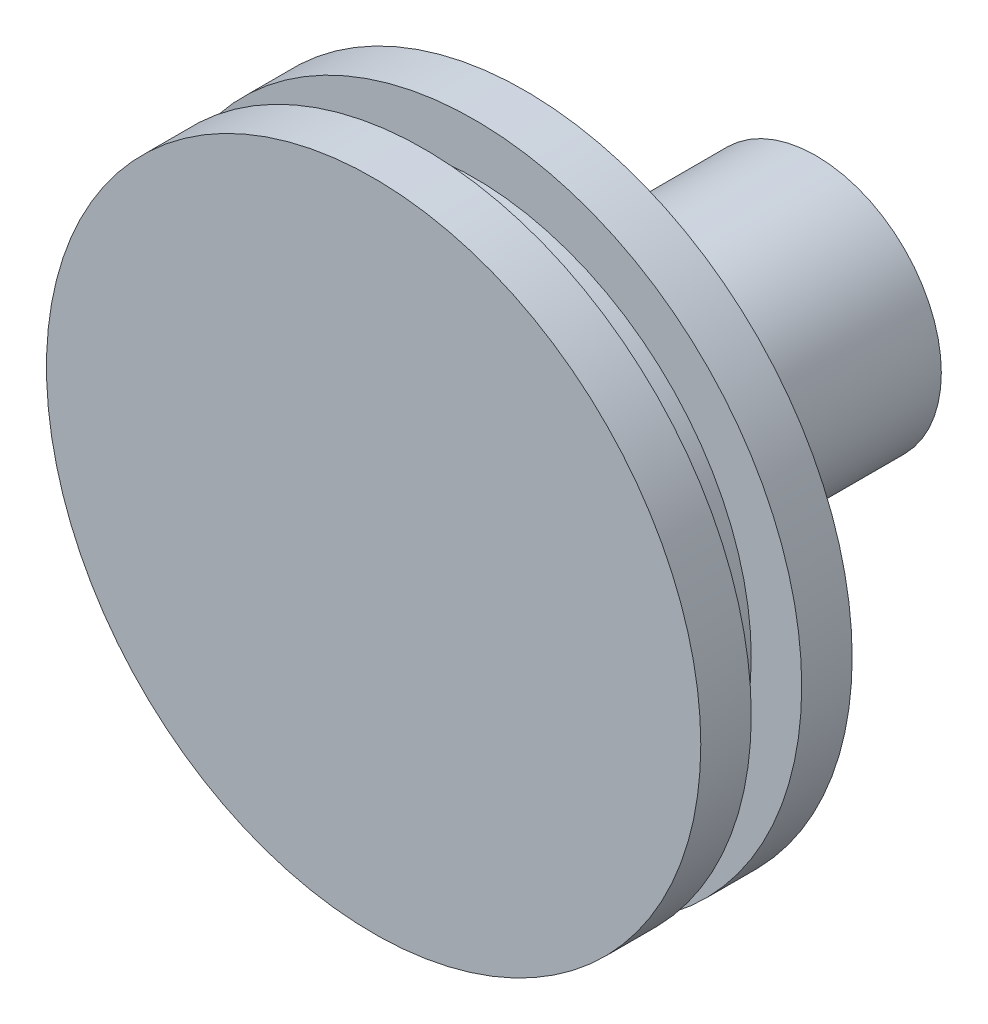
ISO-10303-21;
HEADER;
FILE_DESCRIPTION(('STEP AP214'),'2;1');
FILE_NAME('part.step','',(''),(''),'','','');
FILE_SCHEMA(('AUTOMOTIVE_DESIGN { 1 0 10303 214 1 1 1 1 }'));
ENDSEC;
DATA;
#1=APPLICATION_CONTEXT('core data for automotive mechanical design processes');
#2=APPLICATION_PROTOCOL_DEFINITION('international standard','automotive_design',2000,#1);
#3=PRODUCT_CONTEXT('',#1,'mechanical');
#4=PRODUCT('Part','Part','',(#3));
#5=PRODUCT_RELATED_PRODUCT_CATEGORY('part','',(#4));
#6=PRODUCT_DEFINITION_FORMATION('','',#4);
#7=PRODUCT_DEFINITION_CONTEXT('part definition',#1,'design');
#8=PRODUCT_DEFINITION('design','',#6,#7);
#9=PRODUCT_DEFINITION_SHAPE('','',#8);
#10=(LENGTH_UNIT() NAMED_UNIT(*) SI_UNIT(.MILLI.,.METRE.));
#11=(NAMED_UNIT(*) PLANE_ANGLE_UNIT() SI_UNIT($,.RADIAN.));
#12=(NAMED_UNIT(*) SI_UNIT($,.STERADIAN.) SOLID_ANGLE_UNIT());
#13=UNCERTAINTY_MEASURE_WITH_UNIT(LENGTH_MEASURE(1.E-05),#10,'distance_accuracy_value','');
#14=(GEOMETRIC_REPRESENTATION_CONTEXT(3) GLOBAL_UNCERTAINTY_ASSIGNED_CONTEXT((#13)) GLOBAL_UNIT_ASSIGNED_CONTEXT((#10,
#11,#12)) REPRESENTATION_CONTEXT('',''));
#15=CARTESIAN_POINT('',(0.,0.,0.));
#16=DIRECTION('',(0.,0.,1.));
#17=DIRECTION('',(1.,0.,0.));
#18=AXIS2_PLACEMENT_3D('',#15,#16,#17);
#19=CARTESIAN_POINT('',(-3.60822483003176E-13,2.35874734155946E-13,19.1858910396795));
#20=DIRECTION('',(0.,0.,-1.));
#21=DIRECTION('',(-1.,0.,0.));
#22=AXIS2_PLACEMENT_3D('',#19,#20,#21);
#23=CYLINDRICAL_SURFACE('',#22,3.725);
#24=CARTESIAN_POINT('',(-3.60822483003176E-13,2.35874734155946E-13,0.));
#25=DIRECTION('',(0.,0.,1.));
#26=DIRECTION('',(1.,0.,0.));
#27=AXIS2_PLACEMENT_3D('',#24,#25,#26);
#28=CIRCLE('',#27,3.725);
#29=CARTESIAN_POINT('',(3.72499999999964,2.35874734155946E-13,0.));
#30=VERTEX_POINT('',#29);
#31=EDGE_CURVE('E91',#30,#30,#28,.T.);
#32=ORIENTED_EDGE('',*,*,#31,.T.);
#33=EDGE_LOOP('',(#32));
#34=FACE_BOUND('',#33,.T.);
#35=CARTESIAN_POINT('',(-3.60822483003176E-13,2.35874734155946E-13,8.64999999999998));
#36=DIRECTION('',(0.,0.,1.));
#37=DIRECTION('',(0.,-1.,0.));
#38=AXIS2_PLACEMENT_3D('',#35,#36,#37);
#39=CIRCLE('',#38,3.725);
#40=CARTESIAN_POINT('',(-3.60822483003176E-13,-3.72499999999976,8.64999999999998));
#41=VERTEX_POINT('',#40);
#42=EDGE_CURVE('E11',#41,#41,#39,.T.);
#43=ORIENTED_EDGE('',*,*,#42,.F.);
#44=EDGE_LOOP('',(#43));
#45=FACE_BOUND('',#44,.T.);
#46=ADVANCED_FACE('F34',(#34,#45),#23,.T.);
#47=CARTESIAN_POINT('',(-3.60822483003176E-13,2.35874734155946E-13,0.));
#48=DIRECTION('',(0.,0.,1.));
#49=DIRECTION('',(1.,0.,0.));
#50=AXIS2_PLACEMENT_3D('',#47,#48,#49);
#51=PLANE('',#50);
#52=ORIENTED_EDGE('',*,*,#31,.F.);
#53=EDGE_LOOP('',(#52));
#54=FACE_BOUND('',#53,.T.);
#55=CARTESIAN_POINT('',(-3.60822483003176E-13,2.34696886469719E-13,0.));
#56=DIRECTION('',(0.,0.,1.));
#57=DIRECTION('',(1.,0.,0.));
#58=AXIS2_PLACEMENT_3D('',#55,#56,#57);
#59=CIRCLE('',#58,2.625);
#60=CARTESIAN_POINT('',(-1.88679622641167,1.82500000000024,0.));
#61=VERTEX_POINT('',#60);
#62=CARTESIAN_POINT('',(-1.88679622641169,-1.82499999999976,0.));
#63=VERTEX_POINT('',#62);
#64=EDGE_CURVE('E83',#61,#63,#59,.T.);
#65=ORIENTED_EDGE('',*,*,#64,.T.);
#66=DIRECTION('',(1.,0.,0.));
#67=VECTOR('',#66,1.);
#68=CARTESIAN_POINT('',(-1.88679622641169,-1.82499999999976,0.));
#69=LINE('',#68,#67);
#70=CARTESIAN_POINT('',(1.88679622641095,-1.82499999999977,0.));
#71=VERTEX_POINT('',#70);
#72=EDGE_CURVE('E105',#63,#71,#69,.T.);
#73=ORIENTED_EDGE('',*,*,#72,.T.);
#74=CARTESIAN_POINT('',(-3.60822483003176E-13,2.35874734155946E-13,0.));
#75=DIRECTION('',(0.,0.,1.));
#76=DIRECTION('',(1.,0.,0.));
#77=AXIS2_PLACEMENT_3D('',#74,#75,#76);
#78=CIRCLE('',#77,2.625);
#79=CARTESIAN_POINT('',(1.88679622641097,1.82500000000023,0.));
#80=VERTEX_POINT('',#79);
#81=EDGE_CURVE('E102',#71,#80,#78,.T.);
#82=ORIENTED_EDGE('',*,*,#81,.T.);
#83=DIRECTION('',(-1.,0.,0.));
#84=VECTOR('',#83,1.);
#85=CARTESIAN_POINT('',(1.88679622641097,1.82500000000023,0.));
#86=LINE('',#85,#84);
#87=EDGE_CURVE('E88',#80,#61,#86,.T.);
#88=ORIENTED_EDGE('',*,*,#87,.T.);
#89=EDGE_LOOP('',(#65,#73,#82,#88));
#90=FACE_BOUND('',#89,.T.);
#91=ADVANCED_FACE('F149',(#54,#90),#51,.F.);
#92=CARTESIAN_POINT('',(1.88679622641097,1.82500000000023,19.1858910396795));
#93=DIRECTION('',(0.,-1.,0.));
#94=DIRECTION('',(1.,0.,0.));
#95=AXIS2_PLACEMENT_3D('',#92,#93,#94);
#96=PLANE('',#95);
#97=DIRECTION('',(0.,0.,-1.));
#98=VECTOR('',#97,1.);
#99=CARTESIAN_POINT('',(1.88679622641097,1.82500000000023,19.1858910396795));
#100=LINE('',#99,#98);
#101=CARTESIAN_POINT('',(1.88679622641097,1.82500000000023,8.64999999999998));
#102=VERTEX_POINT('',#101);
#103=EDGE_CURVE('E57',#102,#80,#100,.T.);
#104=ORIENTED_EDGE('',*,*,#103,.F.);
#105=DIRECTION('',(-1.,0.,0.));
#106=VECTOR('',#105,1.);
#107=CARTESIAN_POINT('',(1.88679622641097,1.82500000000023,8.64999999999998));
#108=LINE('',#107,#106);
#109=CARTESIAN_POINT('',(-1.88679622641167,1.82500000000024,8.64999999999998));
#110=VERTEX_POINT('',#109);
#111=EDGE_CURVE('E37',#102,#110,#108,.T.);
#112=ORIENTED_EDGE('',*,*,#111,.T.);
#113=DIRECTION('',(0.,0.,-1.));
#114=VECTOR('',#113,1.);
#115=CARTESIAN_POINT('',(-1.88679622641167,1.82500000000024,19.1858910396795));
#116=LINE('',#115,#114);
#117=EDGE_CURVE('E49',#110,#61,#116,.T.);
#118=ORIENTED_EDGE('',*,*,#117,.T.);
#119=ORIENTED_EDGE('',*,*,#87,.F.);
#120=EDGE_LOOP('',(#104,#112,#118,#119));
#121=FACE_BOUND('',#120,.T.);
#122=ADVANCED_FACE('F90',(#121),#96,.T.);
#123=CARTESIAN_POINT('',(-3.60822483003176E-13,2.35874734155946E-13,19.1858910396795));
#124=DIRECTION('',(0.,0.,-1.));
#125=DIRECTION('',(-1.,0.,0.));
#126=AXIS2_PLACEMENT_3D('',#123,#124,#125);
#127=CYLINDRICAL_SURFACE('',#126,2.625);
#128=DIRECTION('',(0.,0.,-1.));
#129=VECTOR('',#128,1.);
#130=CARTESIAN_POINT('',(1.88679622641095,-1.82499999999977,19.1858910396795));
#131=LINE('',#130,#129);
#132=CARTESIAN_POINT('',(1.88679622641095,-1.82499999999977,8.64999999999998));
#133=VERTEX_POINT('',#132);
#134=EDGE_CURVE('E96',#133,#71,#131,.T.);
#135=ORIENTED_EDGE('',*,*,#134,.F.);
#136=CARTESIAN_POINT('',(-3.60822483003176E-13,2.35874734155946E-13,8.64999999999998));
#137=DIRECTION('',(0.,0.,1.));
#138=DIRECTION('',(0.,-1.,0.));
#139=AXIS2_PLACEMENT_3D('',#136,#137,#138);
#140=CIRCLE('',#139,2.625);
#141=EDGE_CURVE('E110',#133,#102,#140,.T.);
#142=ORIENTED_EDGE('',*,*,#141,.T.);
#143=ORIENTED_EDGE('',*,*,#103,.T.);
#144=ORIENTED_EDGE('',*,*,#81,.F.);
#145=EDGE_LOOP('',(#135,#142,#143,#144));
#146=FACE_BOUND('',#145,.T.);
#147=ADVANCED_FACE('F178',(#146),#127,.F.);
#148=CARTESIAN_POINT('',(-1.88679622641169,-1.82499999999976,19.1858910396795));
#149=DIRECTION('',(0.,1.,0.));
#150=DIRECTION('',(-1.,0.,0.));
#151=AXIS2_PLACEMENT_3D('',#148,#149,#150);
#152=PLANE('',#151);
#153=DIRECTION('',(0.,0.,-1.));
#154=VECTOR('',#153,1.);
#155=CARTESIAN_POINT('',(-1.88679622641169,-1.82499999999976,19.1858910396795));
#156=LINE('',#155,#154);
#157=CARTESIAN_POINT('',(-1.88679622641169,-1.82499999999976,8.64999999999998));
#158=VERTEX_POINT('',#157);
#159=EDGE_CURVE('E93',#158,#63,#156,.T.);
#160=ORIENTED_EDGE('',*,*,#159,.F.);
#161=DIRECTION('',(1.,0.,0.));
#162=VECTOR('',#161,1.);
#163=CARTESIAN_POINT('',(-1.88679622641169,-1.82499999999976,8.64999999999998));
#164=LINE('',#163,#162);
#165=EDGE_CURVE('E80',#158,#133,#164,.T.);
#166=ORIENTED_EDGE('',*,*,#165,.T.);
#167=ORIENTED_EDGE('',*,*,#134,.T.);
#168=ORIENTED_EDGE('',*,*,#72,.F.);
#169=EDGE_LOOP('',(#160,#166,#167,#168));
#170=FACE_BOUND('',#169,.T.);
#171=ADVANCED_FACE('F181',(#170),#152,.T.);
#172=CARTESIAN_POINT('',(-3.60822483003176E-13,2.34696886469719E-13,19.1858910396795));
#173=DIRECTION('',(0.,0.,-1.));
#174=DIRECTION('',(-1.,0.,0.));
#175=AXIS2_PLACEMENT_3D('',#172,#173,#174);
#176=CYLINDRICAL_SURFACE('',#175,2.625);
#177=ORIENTED_EDGE('',*,*,#117,.F.);
#178=CARTESIAN_POINT('',(-3.60822483003176E-13,2.34696886469719E-13,8.64999999999998));
#179=DIRECTION('',(0.,0.,1.));
#180=DIRECTION('',(0.,-1.,0.));
#181=AXIS2_PLACEMENT_3D('',#178,#179,#180);
#182=CIRCLE('',#181,2.625);
#183=EDGE_CURVE('E77',#110,#158,#182,.T.);
#184=ORIENTED_EDGE('',*,*,#183,.T.);
#185=ORIENTED_EDGE('',*,*,#159,.T.);
#186=ORIENTED_EDGE('',*,*,#64,.F.);
#187=EDGE_LOOP('',(#177,#184,#185,#186));
#188=FACE_BOUND('',#187,.T.);
#189=ADVANCED_FACE('F85',(#188),#176,.F.);
#190=CARTESIAN_POINT('',(-3.60822483003176E-13,2.35874734155946E-13,8.64999999999998));
#191=DIRECTION('',(0.,0.,1.));
#192=DIRECTION('',(1.,0.,0.));
#193=AXIS2_PLACEMENT_3D('',#190,#191,#192);
#194=PLANE('',#193);
#195=ORIENTED_EDGE('',*,*,#111,.F.);
#196=ORIENTED_EDGE('',*,*,#141,.F.);
#197=ORIENTED_EDGE('',*,*,#165,.F.);
#198=ORIENTED_EDGE('',*,*,#183,.F.);
#199=EDGE_LOOP('',(#195,#196,#197,#198));
#200=FACE_BOUND('',#199,.T.);
#201=ADVANCED_FACE('F78',(#200),#194,.F.);
#202=CARTESIAN_POINT('',(-3.60822483003176E-13,2.35874734155946E-13,10.15));
#203=DIRECTION('',(0.,0.,-1.));
#204=DIRECTION('',(-1.,0.,0.));
#205=AXIS2_PLACEMENT_3D('',#202,#203,#204);
#206=CYLINDRICAL_SURFACE('',#205,9.725);
#207=CARTESIAN_POINT('',(-3.60822483003176E-13,2.35874734155946E-13,10.15));
#208=DIRECTION('',(0.,0.,1.));
#209=DIRECTION('',(1.,0.,0.));
#210=AXIS2_PLACEMENT_3D('',#207,#208,#209);
#211=CIRCLE('',#210,9.725);
#212=CARTESIAN_POINT('',(9.72499999999964,2.35874734155946E-13,10.15));
#213=VERTEX_POINT('',#212);
#214=EDGE_CURVE('E112',#213,#213,#211,.T.);
#215=ORIENTED_EDGE('',*,*,#214,.F.);
#216=EDGE_LOOP('',(#215));
#217=FACE_BOUND('',#216,.T.);
#218=CARTESIAN_POINT('',(-3.60822483003176E-13,2.35874734155946E-13,8.64999999999998));
#219=DIRECTION('',(0.,0.,1.));
#220=DIRECTION('',(1.,0.,0.));
#221=AXIS2_PLACEMENT_3D('',#218,#219,#220);
#222=CIRCLE('',#221,9.725);
#223=CARTESIAN_POINT('',(9.72499999999964,2.35874734155946E-13,8.64999999999998));
#224=VERTEX_POINT('',#223);
#225=EDGE_CURVE('E113',#224,#224,#222,.T.);
#226=ORIENTED_EDGE('',*,*,#225,.T.);
#227=EDGE_LOOP('',(#226));
#228=FACE_BOUND('',#227,.T.);
#229=ADVANCED_FACE('F164',(#217,#228),#206,.T.);
#230=CARTESIAN_POINT('',(-3.60822483003176E-13,2.35874734155946E-13,10.15));
#231=DIRECTION('',(0.,0.,1.));
#232=DIRECTION('',(1.,0.,0.));
#233=AXIS2_PLACEMENT_3D('',#230,#231,#232);
#234=PLANE('',#233);
#235=CARTESIAN_POINT('',(0.,0.,10.15));
#236=DIRECTION('',(0.,0.,1.));
#237=DIRECTION('',(1.,0.,0.));
#238=AXIS2_PLACEMENT_3D('',#235,#236,#237);
#239=CIRCLE('',#238,8.22499999999957);
#240=CARTESIAN_POINT('',(8.22499999999957,0.,10.15));
#241=VERTEX_POINT('',#240);
#242=EDGE_CURVE('E119',#241,#241,#239,.T.);
#243=ORIENTED_EDGE('',*,*,#242,.F.);
#244=EDGE_LOOP('',(#243));
#245=FACE_BOUND('',#244,.T.);
#246=ORIENTED_EDGE('',*,*,#214,.T.);
#247=EDGE_LOOP('',(#246));
#248=FACE_BOUND('',#247,.T.);
#249=ADVANCED_FACE('F160',(#245,#248),#234,.T.);
#250=ORIENTED_EDGE('',*,*,#42,.T.);
#251=EDGE_LOOP('',(#250));
#252=FACE_BOUND('',#251,.T.);
#253=ORIENTED_EDGE('',*,*,#225,.F.);
#254=EDGE_LOOP('',(#253));
#255=FACE_BOUND('',#254,.T.);
#256=ADVANCED_FACE('F157',(#252,#255),#194,.F.);
#257=CARTESIAN_POINT('',(0.,0.,11.65));
#258=DIRECTION('',(0.,0.,-1.));
#259=DIRECTION('',(-1.,0.,0.));
#260=AXIS2_PLACEMENT_3D('',#257,#258,#259);
#261=CYLINDRICAL_SURFACE('',#260,8.22499999999957);
#262=CARTESIAN_POINT('',(0.,0.,11.65));
#263=DIRECTION('',(0.,0.,1.));
#264=DIRECTION('',(1.,0.,0.));
#265=AXIS2_PLACEMENT_3D('',#262,#263,#264);
#266=CIRCLE('',#265,8.22499999999957);
#267=CARTESIAN_POINT('',(8.22499999999957,0.,11.65));
#268=VERTEX_POINT('',#267);
#269=EDGE_CURVE('E116',#268,#268,#266,.T.);
#270=ORIENTED_EDGE('',*,*,#269,.F.);
#271=EDGE_LOOP('',(#270));
#272=FACE_BOUND('',#271,.T.);
#273=ORIENTED_EDGE('',*,*,#242,.T.);
#274=EDGE_LOOP('',(#273));
#275=FACE_BOUND('',#274,.T.);
#276=ADVANCED_FACE('F136',(#272,#275),#261,.T.);
#277=CARTESIAN_POINT('',(-3.60822483003176E-13,2.35874734155946E-13,13.15));
#278=DIRECTION('',(0.,0.,-1.));
#279=DIRECTION('',(-1.,0.,0.));
#280=AXIS2_PLACEMENT_3D('',#277,#278,#279);
#281=CYLINDRICAL_SURFACE('',#280,9.725);
#282=CARTESIAN_POINT('',(-3.60822483003176E-13,2.35874734155946E-13,13.15));
#283=DIRECTION('',(0.,0.,1.));
#284=DIRECTION('',(1.,0.,0.));
#285=AXIS2_PLACEMENT_3D('',#282,#283,#284);
#286=CIRCLE('',#285,9.725);
#287=CARTESIAN_POINT('',(9.72499999999964,2.35874734155946E-13,13.15));
#288=VERTEX_POINT('',#287);
#289=EDGE_CURVE('E122',#288,#288,#286,.T.);
#290=ORIENTED_EDGE('',*,*,#289,.F.);
#291=EDGE_LOOP('',(#290));
#292=FACE_BOUND('',#291,.T.);
#293=CARTESIAN_POINT('',(-3.60822483003176E-13,2.35874734155946E-13,11.65));
#294=DIRECTION('',(0.,0.,1.));
#295=DIRECTION('',(1.,0.,0.));
#296=AXIS2_PLACEMENT_3D('',#293,#294,#295);
#297=CIRCLE('',#296,9.725);
#298=CARTESIAN_POINT('',(9.72499999999964,2.35874734155946E-13,11.65));
#299=VERTEX_POINT('',#298);
#300=EDGE_CURVE('E125',#299,#299,#297,.T.);
#301=ORIENTED_EDGE('',*,*,#300,.T.);
#302=EDGE_LOOP('',(#301));
#303=FACE_BOUND('',#302,.T.);
#304=ADVANCED_FACE('F133',(#292,#303),#281,.T.);
#305=CARTESIAN_POINT('',(-3.60822483003176E-13,2.35874734155946E-13,13.15));
#306=DIRECTION('',(0.,0.,1.));
#307=DIRECTION('',(1.,0.,0.));
#308=AXIS2_PLACEMENT_3D('',#305,#306,#307);
#309=PLANE('',#308);
#310=ORIENTED_EDGE('',*,*,#289,.T.);
#311=EDGE_LOOP('',(#310));
#312=FACE_BOUND('',#311,.T.);
#313=ADVANCED_FACE('F131',(#312),#309,.T.);
#314=CARTESIAN_POINT('',(-3.60822483003176E-13,2.35874734155946E-13,11.65));
#315=DIRECTION('',(0.,0.,1.));
#316=DIRECTION('',(1.,0.,0.));
#317=AXIS2_PLACEMENT_3D('',#314,#315,#316);
#318=PLANE('',#317);
#319=ORIENTED_EDGE('',*,*,#269,.T.);
#320=EDGE_LOOP('',(#319));
#321=FACE_BOUND('',#320,.T.);
#322=ORIENTED_EDGE('',*,*,#300,.F.);
#323=EDGE_LOOP('',(#322));
#324=FACE_BOUND('',#323,.T.);
#325=ADVANCED_FACE('F140',(#321,#324),#318,.F.);
#326=CLOSED_SHELL('',(#46,#91,#122,#147,#171,#189,#201,#229,#249,#256,#276,#304,#313,#325));
#327=MANIFOLD_SOLID_BREP('B2',#326);
#328=ADVANCED_BREP_SHAPE_REPRESENTATION('',(#18,#327),#14);
#329=SHAPE_DEFINITION_REPRESENTATION(#9,#328);
ENDSEC;
END-ISO-10303-21;
